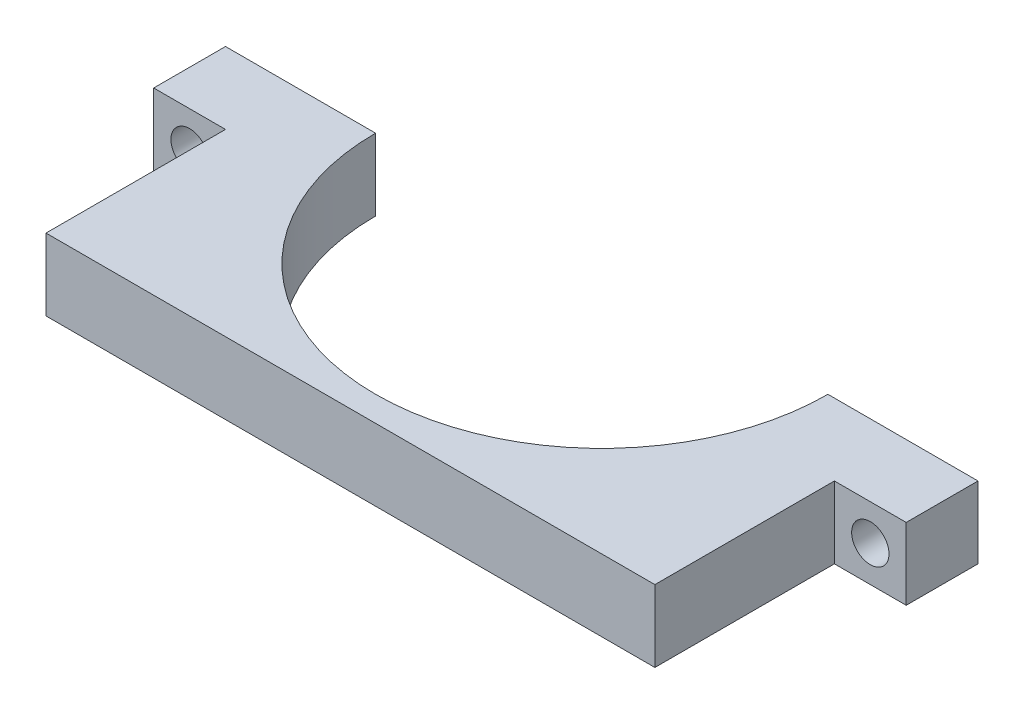
ISO-10303-21;
HEADER;
FILE_DESCRIPTION(('STEP AP214'),'2;1');
FILE_NAME('part.step','',(''),(''),'','','');
FILE_SCHEMA(('AUTOMOTIVE_DESIGN { 1 0 10303 214 1 1 1 1 }'));
ENDSEC;
DATA;
#1=APPLICATION_CONTEXT('core data for automotive mechanical design processes');
#2=APPLICATION_PROTOCOL_DEFINITION('international standard','automotive_design',2000,#1);
#3=PRODUCT_CONTEXT('',#1,'mechanical');
#4=PRODUCT('Part','Part','',(#3));
#5=PRODUCT_RELATED_PRODUCT_CATEGORY('part','',(#4));
#6=PRODUCT_DEFINITION_FORMATION('','',#4);
#7=PRODUCT_DEFINITION_CONTEXT('part definition',#1,'design');
#8=PRODUCT_DEFINITION('design','',#6,#7);
#9=PRODUCT_DEFINITION_SHAPE('','',#8);
#10=(LENGTH_UNIT() NAMED_UNIT(*) SI_UNIT(.MILLI.,.METRE.));
#11=(NAMED_UNIT(*) PLANE_ANGLE_UNIT() SI_UNIT($,.RADIAN.));
#12=(NAMED_UNIT(*) SI_UNIT($,.STERADIAN.) SOLID_ANGLE_UNIT());
#13=UNCERTAINTY_MEASURE_WITH_UNIT(LENGTH_MEASURE(1.E-05),#10,'distance_accuracy_value','');
#14=(GEOMETRIC_REPRESENTATION_CONTEXT(3) GLOBAL_UNCERTAINTY_ASSIGNED_CONTEXT((#13)) GLOBAL_UNIT_ASSIGNED_CONTEXT((#10,
#11,#12)) REPRESENTATION_CONTEXT('',''));
#15=CARTESIAN_POINT('',(0.,0.,0.));
#16=DIRECTION('',(0.,0.,1.));
#17=DIRECTION('',(1.,0.,0.));
#18=AXIS2_PLACEMENT_3D('',#15,#16,#17);
#19=CARTESIAN_POINT('',(5.08015601965994,12.7,0.));
#20=DIRECTION('',(0.,-1.,0.));
#21=DIRECTION('',(0.,0.,-1.));
#22=AXIS2_PLACEMENT_3D('',#19,#20,#21);
#23=CYLINDRICAL_SURFACE('',#22,40.005);
#24=CARTESIAN_POINT('',(5.08015601965994,0.,0.));
#25=DIRECTION('',(0.,-1.,0.));
#26=DIRECTION('',(0.,0.,1.));
#27=AXIS2_PLACEMENT_3D('',#24,#25,#26);
#28=CIRCLE('',#27,40.005);
#29=CARTESIAN_POINT('',(45.0851560196599,0.,0.));
#30=VERTEX_POINT('',#29);
#31=CARTESIAN_POINT('',(-34.9248439803401,0.,0.));
#32=VERTEX_POINT('',#31);
#33=EDGE_CURVE('E141',#30,#32,#28,.T.);
#34=ORIENTED_EDGE('',*,*,#33,.T.);
#35=DIRECTION('',(0.,-1.,0.));
#36=VECTOR('',#35,1.);
#37=CARTESIAN_POINT('',(-34.9248439803401,12.7,0.));
#38=LINE('',#37,#36);
#39=CARTESIAN_POINT('',(-34.9248439803401,12.7,0.));
#40=VERTEX_POINT('',#39);
#41=EDGE_CURVE('E11',#40,#32,#38,.T.);
#42=ORIENTED_EDGE('',*,*,#41,.F.);
#43=CARTESIAN_POINT('',(5.08015601965994,12.7,0.));
#44=DIRECTION('',(0.,-1.,0.));
#45=DIRECTION('',(0.,0.,1.));
#46=AXIS2_PLACEMENT_3D('',#43,#44,#45);
#47=CIRCLE('',#46,40.005);
#48=CARTESIAN_POINT('',(45.0851560196599,12.7,0.));
#49=VERTEX_POINT('',#48);
#50=EDGE_CURVE('E160',#49,#40,#47,.T.);
#51=ORIENTED_EDGE('',*,*,#50,.F.);
#52=DIRECTION('',(0.,-1.,0.));
#53=VECTOR('',#52,1.);
#54=CARTESIAN_POINT('',(45.0851560196599,12.7,0.));
#55=LINE('',#54,#53);
#56=EDGE_CURVE('E137',#49,#30,#55,.T.);
#57=ORIENTED_EDGE('',*,*,#56,.T.);
#58=EDGE_LOOP('',(#34,#42,#51,#57));
#59=FACE_BOUND('',#58,.T.);
#60=ADVANCED_FACE('F33',(#59),#23,.F.);
#61=CARTESIAN_POINT('',(-34.9248439803401,12.7,0.));
#62=DIRECTION('',(0.,0.,1.));
#63=DIRECTION('',(1.,0.,0.));
#64=AXIS2_PLACEMENT_3D('',#61,#62,#63);
#65=PLANE('',#64);
#66=CARTESIAN_POINT('',(-55.1178439803401,6.35,0.));
#67=DIRECTION('',(0.,0.,1.));
#68=DIRECTION('',(1.,0.,0.));
#69=AXIS2_PLACEMENT_3D('',#66,#67,#68);
#70=CIRCLE('',#69,3.302);
#71=CARTESIAN_POINT('',(-51.8158439803401,6.35,0.));
#72=VERTEX_POINT('',#71);
#73=EDGE_CURVE('E212',#72,#72,#70,.F.);
#74=ORIENTED_EDGE('',*,*,#73,.F.);
#75=EDGE_LOOP('',(#74));
#76=FACE_BOUND('',#75,.T.);
#77=DIRECTION('',(-1.,0.,0.));
#78=VECTOR('',#77,1.);
#79=CARTESIAN_POINT('',(-34.9248439803401,0.,0.));
#80=LINE('',#79,#78);
#81=CARTESIAN_POINT('',(-61.4678439803401,0.,0.));
#82=VERTEX_POINT('',#81);
#83=EDGE_CURVE('E144',#32,#82,#80,.T.);
#84=ORIENTED_EDGE('',*,*,#83,.T.);
#85=DIRECTION('',(0.,-1.,0.));
#86=VECTOR('',#85,1.);
#87=CARTESIAN_POINT('',(-61.4678439803401,12.7,0.));
#88=LINE('',#87,#86);
#89=CARTESIAN_POINT('',(-61.4678439803401,12.7,0.));
#90=VERTEX_POINT('',#89);
#91=EDGE_CURVE('E41',#90,#82,#88,.T.);
#92=ORIENTED_EDGE('',*,*,#91,.F.);
#93=DIRECTION('',(-1.,0.,0.));
#94=VECTOR('',#93,1.);
#95=CARTESIAN_POINT('',(-34.9248439803401,12.7,0.));
#96=LINE('',#95,#94);
#97=EDGE_CURVE('E98',#40,#90,#96,.T.);
#98=ORIENTED_EDGE('',*,*,#97,.F.);
#99=ORIENTED_EDGE('',*,*,#41,.T.);
#100=EDGE_LOOP('',(#84,#92,#98,#99));
#101=FACE_BOUND('',#100,.T.);
#102=ADVANCED_FACE('F230',(#76,#101),#65,.F.);
#103=CARTESIAN_POINT('',(-61.4678439803401,12.7,0.));
#104=DIRECTION('',(1.,0.,0.));
#105=DIRECTION('',(0.,0.,-1.));
#106=AXIS2_PLACEMENT_3D('',#103,#104,#105);
#107=PLANE('',#106);
#108=DIRECTION('',(0.,0.,1.));
#109=VECTOR('',#108,1.);
#110=CARTESIAN_POINT('',(-61.4678439803401,0.,0.));
#111=LINE('',#110,#109);
#112=CARTESIAN_POINT('',(-61.4678439803401,0.,12.7));
#113=VERTEX_POINT('',#112);
#114=EDGE_CURVE('E147',#82,#113,#111,.T.);
#115=ORIENTED_EDGE('',*,*,#114,.T.);
#116=DIRECTION('',(0.,-1.,0.));
#117=VECTOR('',#116,1.);
#118=CARTESIAN_POINT('',(-61.4678439803401,12.7,12.7));
#119=LINE('',#118,#117);
#120=CARTESIAN_POINT('',(-61.4678439803401,12.7,12.7));
#121=VERTEX_POINT('',#120);
#122=EDGE_CURVE('E173',#121,#113,#119,.T.);
#123=ORIENTED_EDGE('',*,*,#122,.F.);
#124=DIRECTION('',(0.,0.,1.));
#125=VECTOR('',#124,1.);
#126=CARTESIAN_POINT('',(-61.4678439803401,12.7,0.));
#127=LINE('',#126,#125);
#128=EDGE_CURVE('E181',#90,#121,#127,.T.);
#129=ORIENTED_EDGE('',*,*,#128,.F.);
#130=ORIENTED_EDGE('',*,*,#91,.T.);
#131=EDGE_LOOP('',(#115,#123,#129,#130));
#132=FACE_BOUND('',#131,.T.);
#133=ADVANCED_FACE('F179',(#132),#107,.F.);
#134=CARTESIAN_POINT('',(-61.4678439803401,12.7,12.7));
#135=DIRECTION('',(0.,0.,-1.));
#136=DIRECTION('',(-1.,0.,0.));
#137=AXIS2_PLACEMENT_3D('',#134,#135,#136);
#138=PLANE('',#137);
#139=CARTESIAN_POINT('',(-55.1178439803401,6.35,12.7));
#140=DIRECTION('',(0.,0.,1.));
#141=DIRECTION('',(1.,0.,0.));
#142=AXIS2_PLACEMENT_3D('',#139,#140,#141);
#143=CIRCLE('',#142,3.302);
#144=CARTESIAN_POINT('',(-51.8158439803401,6.35,12.7));
#145=VERTEX_POINT('',#144);
#146=EDGE_CURVE('E215',#145,#145,#143,.T.);
#147=ORIENTED_EDGE('',*,*,#146,.F.);
#148=EDGE_LOOP('',(#147));
#149=FACE_BOUND('',#148,.T.);
#150=DIRECTION('',(1.,0.,0.));
#151=VECTOR('',#150,1.);
#152=CARTESIAN_POINT('',(-61.4678439803401,0.,12.7));
#153=LINE('',#152,#151);
#154=CARTESIAN_POINT('',(-48.7678439803401,0.,12.7));
#155=VERTEX_POINT('',#154);
#156=EDGE_CURVE('E149',#113,#155,#153,.T.);
#157=ORIENTED_EDGE('',*,*,#156,.T.);
#158=DIRECTION('',(0.,-1.,0.));
#159=VECTOR('',#158,1.);
#160=CARTESIAN_POINT('',(-48.7678439803401,12.7,12.7));
#161=LINE('',#160,#159);
#162=CARTESIAN_POINT('',(-48.7678439803401,12.7,12.7));
#163=VERTEX_POINT('',#162);
#164=EDGE_CURVE('E170',#163,#155,#161,.T.);
#165=ORIENTED_EDGE('',*,*,#164,.F.);
#166=DIRECTION('',(1.,0.,0.));
#167=VECTOR('',#166,1.);
#168=CARTESIAN_POINT('',(-61.4678439803401,12.7,12.7));
#169=LINE('',#168,#167);
#170=EDGE_CURVE('E199',#121,#163,#169,.T.);
#171=ORIENTED_EDGE('',*,*,#170,.F.);
#172=ORIENTED_EDGE('',*,*,#122,.T.);
#173=EDGE_LOOP('',(#157,#165,#171,#172));
#174=FACE_BOUND('',#173,.T.);
#175=ADVANCED_FACE('F190',(#149,#174),#138,.F.);
#176=CARTESIAN_POINT('',(-48.7678439803401,12.7,12.7));
#177=DIRECTION('',(1.,0.,0.));
#178=DIRECTION('',(0.,0.,-1.));
#179=AXIS2_PLACEMENT_3D('',#176,#177,#178);
#180=PLANE('',#179);
#181=DIRECTION('',(0.,0.,1.));
#182=VECTOR('',#181,1.);
#183=CARTESIAN_POINT('',(-48.7678439803401,0.,12.7));
#184=LINE('',#183,#182);
#185=CARTESIAN_POINT('',(-48.7678439803401,0.,44.45));
#186=VERTEX_POINT('',#185);
#187=EDGE_CURVE('E151',#155,#186,#184,.T.);
#188=ORIENTED_EDGE('',*,*,#187,.T.);
#189=DIRECTION('',(0.,-1.,0.));
#190=VECTOR('',#189,1.);
#191=CARTESIAN_POINT('',(-48.7678439803401,12.7,44.45));
#192=LINE('',#191,#190);
#193=CARTESIAN_POINT('',(-48.7678439803401,12.7,44.45));
#194=VERTEX_POINT('',#193);
#195=EDGE_CURVE('E167',#194,#186,#192,.T.);
#196=ORIENTED_EDGE('',*,*,#195,.F.);
#197=DIRECTION('',(0.,0.,1.));
#198=VECTOR('',#197,1.);
#199=CARTESIAN_POINT('',(-48.7678439803401,12.7,12.7));
#200=LINE('',#199,#198);
#201=EDGE_CURVE('E196',#163,#194,#200,.T.);
#202=ORIENTED_EDGE('',*,*,#201,.F.);
#203=ORIENTED_EDGE('',*,*,#164,.T.);
#204=EDGE_LOOP('',(#188,#196,#202,#203));
#205=FACE_BOUND('',#204,.T.);
#206=ADVANCED_FACE('F194',(#205),#180,.F.);
#207=CARTESIAN_POINT('',(-48.7678439803401,12.7,44.45));
#208=DIRECTION('',(0.,0.,-1.));
#209=DIRECTION('',(-1.,0.,0.));
#210=AXIS2_PLACEMENT_3D('',#207,#208,#209);
#211=PLANE('',#210);
#212=DIRECTION('',(1.,0.,0.));
#213=VECTOR('',#212,1.);
#214=CARTESIAN_POINT('',(-48.7678439803401,0.,44.45));
#215=LINE('',#214,#213);
#216=CARTESIAN_POINT('',(58.9281560196599,0.,44.45));
#217=VERTEX_POINT('',#216);
#218=EDGE_CURVE('E153',#186,#217,#215,.T.);
#219=ORIENTED_EDGE('',*,*,#218,.T.);
#220=DIRECTION('',(0.,-1.,0.));
#221=VECTOR('',#220,1.);
#222=CARTESIAN_POINT('',(58.9281560196599,12.7,44.45));
#223=LINE('',#222,#221);
#224=CARTESIAN_POINT('',(58.9281560196599,12.7,44.45));
#225=VERTEX_POINT('',#224);
#226=EDGE_CURVE('E164',#225,#217,#223,.T.);
#227=ORIENTED_EDGE('',*,*,#226,.F.);
#228=DIRECTION('',(1.,0.,0.));
#229=VECTOR('',#228,1.);
#230=CARTESIAN_POINT('',(-48.7678439803401,12.7,44.45));
#231=LINE('',#230,#229);
#232=EDGE_CURVE('E198',#194,#225,#231,.T.);
#233=ORIENTED_EDGE('',*,*,#232,.F.);
#234=ORIENTED_EDGE('',*,*,#195,.T.);
#235=EDGE_LOOP('',(#219,#227,#233,#234));
#236=FACE_BOUND('',#235,.T.);
#237=ADVANCED_FACE('F228',(#236),#211,.F.);
#238=CARTESIAN_POINT('',(58.9281560196599,12.7,44.45));
#239=DIRECTION('',(-1.,0.,0.));
#240=DIRECTION('',(0.,0.,1.));
#241=AXIS2_PLACEMENT_3D('',#238,#239,#240);
#242=PLANE('',#241);
#243=DIRECTION('',(0.,0.,-1.));
#244=VECTOR('',#243,1.);
#245=CARTESIAN_POINT('',(58.9281560196599,0.,44.45));
#246=LINE('',#245,#244);
#247=CARTESIAN_POINT('',(58.9281560196599,0.,12.7));
#248=VERTEX_POINT('',#247);
#249=EDGE_CURVE('E155',#217,#248,#246,.T.);
#250=ORIENTED_EDGE('',*,*,#249,.T.);
#251=DIRECTION('',(0.,-1.,0.));
#252=VECTOR('',#251,1.);
#253=CARTESIAN_POINT('',(58.9281560196599,12.7,12.7));
#254=LINE('',#253,#252);
#255=CARTESIAN_POINT('',(58.9281560196599,12.7,12.7));
#256=VERTEX_POINT('',#255);
#257=EDGE_CURVE('E132',#256,#248,#254,.T.);
#258=ORIENTED_EDGE('',*,*,#257,.F.);
#259=DIRECTION('',(0.,0.,-1.));
#260=VECTOR('',#259,1.);
#261=CARTESIAN_POINT('',(58.9281560196599,12.7,44.45));
#262=LINE('',#261,#260);
#263=EDGE_CURVE('E123',#225,#256,#262,.T.);
#264=ORIENTED_EDGE('',*,*,#263,.F.);
#265=ORIENTED_EDGE('',*,*,#226,.T.);
#266=EDGE_LOOP('',(#250,#258,#264,#265));
#267=FACE_BOUND('',#266,.T.);
#268=ADVANCED_FACE('F242',(#267),#242,.F.);
#269=CARTESIAN_POINT('',(58.9281560196599,12.7,12.7));
#270=DIRECTION('',(0.,0.,-1.));
#271=DIRECTION('',(-1.,0.,0.));
#272=AXIS2_PLACEMENT_3D('',#269,#270,#271);
#273=PLANE('',#272);
#274=CARTESIAN_POINT('',(65.2781560196599,6.35,12.7));
#275=DIRECTION('',(0.,0.,1.));
#276=DIRECTION('',(1.,0.,0.));
#277=AXIS2_PLACEMENT_3D('',#274,#275,#276);
#278=CIRCLE('',#277,3.302);
#279=CARTESIAN_POINT('',(68.5801560196599,6.35,12.7));
#280=VERTEX_POINT('',#279);
#281=EDGE_CURVE('E209',#280,#280,#278,.T.);
#282=ORIENTED_EDGE('',*,*,#281,.F.);
#283=EDGE_LOOP('',(#282));
#284=FACE_BOUND('',#283,.T.);
#285=DIRECTION('',(1.,0.,0.));
#286=VECTOR('',#285,1.);
#287=CARTESIAN_POINT('',(58.9281560196599,0.,12.7));
#288=LINE('',#287,#286);
#289=CARTESIAN_POINT('',(71.6281560196599,0.,12.7));
#290=VERTEX_POINT('',#289);
#291=EDGE_CURVE('E131',#248,#290,#288,.T.);
#292=ORIENTED_EDGE('',*,*,#291,.T.);
#293=DIRECTION('',(0.,-1.,0.));
#294=VECTOR('',#293,1.);
#295=CARTESIAN_POINT('',(71.6281560196599,12.7,12.7));
#296=LINE('',#295,#294);
#297=CARTESIAN_POINT('',(71.6281560196599,12.7,12.7));
#298=VERTEX_POINT('',#297);
#299=EDGE_CURVE('E128',#298,#290,#296,.T.);
#300=ORIENTED_EDGE('',*,*,#299,.F.);
#301=DIRECTION('',(1.,0.,0.));
#302=VECTOR('',#301,1.);
#303=CARTESIAN_POINT('',(58.9281560196599,12.7,12.7));
#304=LINE('',#303,#302);
#305=EDGE_CURVE('E117',#256,#298,#304,.T.);
#306=ORIENTED_EDGE('',*,*,#305,.F.);
#307=ORIENTED_EDGE('',*,*,#257,.T.);
#308=EDGE_LOOP('',(#292,#300,#306,#307));
#309=FACE_BOUND('',#308,.T.);
#310=ADVANCED_FACE('F129',(#284,#309),#273,.F.);
#311=CARTESIAN_POINT('',(71.6281560196599,12.7,12.7));
#312=DIRECTION('',(-1.,0.,0.));
#313=DIRECTION('',(0.,0.,1.));
#314=AXIS2_PLACEMENT_3D('',#311,#312,#313);
#315=PLANE('',#314);
#316=DIRECTION('',(0.,0.,-1.));
#317=VECTOR('',#316,1.);
#318=CARTESIAN_POINT('',(71.6281560196599,0.,12.7));
#319=LINE('',#318,#317);
#320=CARTESIAN_POINT('',(71.6281560196599,0.,0.));
#321=VERTEX_POINT('',#320);
#322=EDGE_CURVE('E84',#290,#321,#319,.T.);
#323=ORIENTED_EDGE('',*,*,#322,.T.);
#324=DIRECTION('',(0.,-1.,0.));
#325=VECTOR('',#324,1.);
#326=CARTESIAN_POINT('',(71.6281560196599,12.7,0.));
#327=LINE('',#326,#325);
#328=CARTESIAN_POINT('',(71.6281560196599,12.7,0.));
#329=VERTEX_POINT('',#328);
#330=EDGE_CURVE('E133',#329,#321,#327,.T.);
#331=ORIENTED_EDGE('',*,*,#330,.F.);
#332=DIRECTION('',(0.,0.,-1.));
#333=VECTOR('',#332,1.);
#334=CARTESIAN_POINT('',(71.6281560196599,12.7,12.7));
#335=LINE('',#334,#333);
#336=EDGE_CURVE('E121',#298,#329,#335,.T.);
#337=ORIENTED_EDGE('',*,*,#336,.F.);
#338=ORIENTED_EDGE('',*,*,#299,.T.);
#339=EDGE_LOOP('',(#323,#331,#337,#338));
#340=FACE_BOUND('',#339,.T.);
#341=ADVANCED_FACE('F135',(#340),#315,.F.);
#342=CARTESIAN_POINT('',(71.6281560196599,12.7,0.));
#343=DIRECTION('',(0.,0.,1.));
#344=DIRECTION('',(1.,0.,0.));
#345=AXIS2_PLACEMENT_3D('',#342,#343,#344);
#346=PLANE('',#345);
#347=CARTESIAN_POINT('',(65.2781560196599,6.35,0.));
#348=DIRECTION('',(0.,0.,1.));
#349=DIRECTION('',(1.,0.,0.));
#350=AXIS2_PLACEMENT_3D('',#347,#348,#349);
#351=CIRCLE('',#350,3.302);
#352=CARTESIAN_POINT('',(68.5801560196599,6.35,0.));
#353=VERTEX_POINT('',#352);
#354=EDGE_CURVE('E145',#353,#353,#351,.F.);
#355=ORIENTED_EDGE('',*,*,#354,.F.);
#356=EDGE_LOOP('',(#355));
#357=FACE_BOUND('',#356,.T.);
#358=DIRECTION('',(-1.,0.,0.));
#359=VECTOR('',#358,1.);
#360=CARTESIAN_POINT('',(71.6281560196599,0.,0.));
#361=LINE('',#360,#359);
#362=EDGE_CURVE('E90',#321,#30,#361,.T.);
#363=ORIENTED_EDGE('',*,*,#362,.T.);
#364=ORIENTED_EDGE('',*,*,#56,.F.);
#365=DIRECTION('',(-1.,0.,0.));
#366=VECTOR('',#365,1.);
#367=CARTESIAN_POINT('',(71.6281560196599,12.7,0.));
#368=LINE('',#367,#366);
#369=EDGE_CURVE('E49',#329,#49,#368,.T.);
#370=ORIENTED_EDGE('',*,*,#369,.F.);
#371=ORIENTED_EDGE('',*,*,#330,.T.);
#372=EDGE_LOOP('',(#363,#364,#370,#371));
#373=FACE_BOUND('',#372,.T.);
#374=ADVANCED_FACE('F257',(#357,#373),#346,.F.);
#375=CARTESIAN_POINT('',(5.08015601965994,12.7,0.));
#376=DIRECTION('',(0.,1.,0.));
#377=DIRECTION('',(0.,0.,1.));
#378=AXIS2_PLACEMENT_3D('',#375,#376,#377);
#379=PLANE('',#378);
#380=ORIENTED_EDGE('',*,*,#50,.T.);
#381=ORIENTED_EDGE('',*,*,#97,.T.);
#382=ORIENTED_EDGE('',*,*,#128,.T.);
#383=ORIENTED_EDGE('',*,*,#170,.T.);
#384=ORIENTED_EDGE('',*,*,#201,.T.);
#385=ORIENTED_EDGE('',*,*,#232,.T.);
#386=ORIENTED_EDGE('',*,*,#263,.T.);
#387=ORIENTED_EDGE('',*,*,#305,.T.);
#388=ORIENTED_EDGE('',*,*,#336,.T.);
#389=ORIENTED_EDGE('',*,*,#369,.T.);
#390=EDGE_LOOP('',(#380,#381,#382,#383,#384,#385,#386,#387,#388,#389));
#391=FACE_BOUND('',#390,.T.);
#392=ADVANCED_FACE('F119',(#391),#379,.T.);
#393=CARTESIAN_POINT('',(5.08015601965994,0.,0.));
#394=DIRECTION('',(0.,1.,0.));
#395=DIRECTION('',(0.,0.,1.));
#396=AXIS2_PLACEMENT_3D('',#393,#394,#395);
#397=PLANE('',#396);
#398=ORIENTED_EDGE('',*,*,#33,.F.);
#399=ORIENTED_EDGE('',*,*,#362,.F.);
#400=ORIENTED_EDGE('',*,*,#322,.F.);
#401=ORIENTED_EDGE('',*,*,#291,.F.);
#402=ORIENTED_EDGE('',*,*,#249,.F.);
#403=ORIENTED_EDGE('',*,*,#218,.F.);
#404=ORIENTED_EDGE('',*,*,#187,.F.);
#405=ORIENTED_EDGE('',*,*,#156,.F.);
#406=ORIENTED_EDGE('',*,*,#114,.F.);
#407=ORIENTED_EDGE('',*,*,#83,.F.);
#408=EDGE_LOOP('',(#398,#399,#400,#401,#402,#403,#404,#405,#406,#407));
#409=FACE_BOUND('',#408,.T.);
#410=ADVANCED_FACE('F185',(#409),#397,.F.);
#411=CARTESIAN_POINT('',(65.2781560196599,6.35,-0.00100000000003049));
#412=DIRECTION('',(0.,0.,1.));
#413=DIRECTION('',(1.,0.,0.));
#414=AXIS2_PLACEMENT_3D('',#411,#412,#413);
#415=CYLINDRICAL_SURFACE('',#414,3.302);
#416=CARTESIAN_POINT('',(68.5801560196599,6.35,12.7));
#417=CARTESIAN_POINT('',(68.5801560196599,6.35,12.5677083333333));
#418=CARTESIAN_POINT('',(68.5801560196599,6.35,12.4354166666667));
#419=CARTESIAN_POINT('',(68.5801560196599,6.35,12.1708333333333));
#420=CARTESIAN_POINT('',(68.5801560196599,6.35,12.0385416666667));
#421=CARTESIAN_POINT('',(68.5801560196599,6.35,11.7739583333333));
#422=CARTESIAN_POINT('',(68.5801560196599,6.35,11.6416666666667));
#423=CARTESIAN_POINT('',(68.5801560196599,6.35,11.3770833333333));
#424=CARTESIAN_POINT('',(68.5801560196599,6.35,11.2447916666667));
#425=CARTESIAN_POINT('',(68.5801560196599,6.35,10.9802083333333));
#426=CARTESIAN_POINT('',(68.5801560196599,6.35,10.8479166666667));
#427=CARTESIAN_POINT('',(68.5801560196599,6.35,10.5833333333333));
#428=CARTESIAN_POINT('',(68.5801560196599,6.35,10.4510416666666));
#429=CARTESIAN_POINT('',(68.5801560196599,6.35,10.1864583333333));
#430=CARTESIAN_POINT('',(68.5801560196599,6.35,10.0541666666666));
#431=CARTESIAN_POINT('',(68.5801560196599,6.35,9.78958333333332));
#432=CARTESIAN_POINT('',(68.5801560196599,6.35,9.65729166666665));
#433=CARTESIAN_POINT('',(68.5801560196599,6.35,9.39270833333331));
#434=CARTESIAN_POINT('',(68.5801560196599,6.35,9.26041666666665));
#435=CARTESIAN_POINT('',(68.5801560196599,6.35,8.99583333333331));
#436=CARTESIAN_POINT('',(68.5801560196599,6.35,8.86354166666665));
#437=CARTESIAN_POINT('',(68.5801560196599,6.35,8.59895833333331));
#438=CARTESIAN_POINT('',(68.5801560196599,6.35,8.46666666666665));
#439=CARTESIAN_POINT('',(68.5801560196599,6.35,8.20208333333331));
#440=CARTESIAN_POINT('',(68.5801560196599,6.35,8.06979166666665));
#441=CARTESIAN_POINT('',(68.5801560196599,6.35,7.80520833333331));
#442=CARTESIAN_POINT('',(68.5801560196599,6.35,7.67291666666665));
#443=CARTESIAN_POINT('',(68.5801560196599,6.35,7.40833333333331));
#444=CARTESIAN_POINT('',(68.5801560196599,6.35,7.27604166666664));
#445=CARTESIAN_POINT('',(68.5801560196599,6.35,7.01145833333331));
#446=CARTESIAN_POINT('',(68.5801560196599,6.35,6.87916666666664));
#447=CARTESIAN_POINT('',(68.5801560196599,6.35,6.61458333333331));
#448=CARTESIAN_POINT('',(68.5801560196599,6.35,6.48229166666664));
#449=CARTESIAN_POINT('',(68.5801560196599,6.35,6.21770833333331));
#450=CARTESIAN_POINT('',(68.5801560196599,6.35,6.08541666666664));
#451=CARTESIAN_POINT('',(68.5801560196599,6.35,5.82083333333331));
#452=CARTESIAN_POINT('',(68.5801560196599,6.35,5.68854166666664));
#453=CARTESIAN_POINT('',(68.5801560196599,6.35,5.42395833333331));
#454=CARTESIAN_POINT('',(68.5801560196599,6.35,5.29166666666664));
#455=CARTESIAN_POINT('',(68.5801560196599,6.35,5.02708333333331));
#456=CARTESIAN_POINT('',(68.5801560196599,6.35,4.89479166666664));
#457=CARTESIAN_POINT('',(68.5801560196599,6.35,4.63020833333331));
#458=CARTESIAN_POINT('',(68.5801560196599,6.35,4.49791666666664));
#459=CARTESIAN_POINT('',(68.5801560196599,6.35,4.23333333333331));
#460=CARTESIAN_POINT('',(68.5801560196599,6.35,4.10104166666664));
#461=CARTESIAN_POINT('',(68.5801560196599,6.35,3.83645833333331));
#462=CARTESIAN_POINT('',(68.5801560196599,6.35,3.70416666666664));
#463=CARTESIAN_POINT('',(68.5801560196599,6.35,3.43958333333331));
#464=CARTESIAN_POINT('',(68.5801560196599,6.35,3.30729166666664));
#465=CARTESIAN_POINT('',(68.5801560196599,6.35,3.04270833333331));
#466=CARTESIAN_POINT('',(68.5801560196599,6.35,2.91041666666664));
#467=CARTESIAN_POINT('',(68.5801560196599,6.35,2.64583333333331));
#468=CARTESIAN_POINT('',(68.5801560196599,6.35,2.51354166666664));
#469=CARTESIAN_POINT('',(68.5801560196599,6.35,2.2489583333333));
#470=CARTESIAN_POINT('',(68.5801560196599,6.35,2.11666666666664));
#471=CARTESIAN_POINT('',(68.5801560196599,6.35,1.8520833333333));
#472=CARTESIAN_POINT('',(68.5801560196599,6.35,1.71979166666664));
#473=CARTESIAN_POINT('',(68.5801560196599,6.35,1.4552083333333));
#474=CARTESIAN_POINT('',(68.5801560196599,6.35,1.32291666666664));
#475=CARTESIAN_POINT('',(68.5801560196599,6.35,1.0583333333333));
#476=CARTESIAN_POINT('',(68.5801560196599,6.35,0.926041666666637));
#477=CARTESIAN_POINT('',(68.5801560196599,6.35,0.661458333333303));
#478=CARTESIAN_POINT('',(68.5801560196599,6.35,0.529166666666637));
#479=CARTESIAN_POINT('',(68.5801560196599,6.35,0.264583333333303));
#480=CARTESIAN_POINT('',(68.5801560196599,6.35,0.132291666666636));
#481=CARTESIAN_POINT('',(68.5801560196599,6.35,0.));
#482=B_SPLINE_CURVE_WITH_KNOTS('',3,(#416,#417,#418,#419,#420,#421,#422,#423,#424,#425,#426,
#427,#428,#429,#430,#431,#432,#433,#434,#435,#436,#437,#438,#439,#440,#441,#442,#443,#444,#445,
#446,#447,#448,#449,#450,#451,#452,#453,#454,#455,#456,#457,#458,#459,#460,#461,#462,#463,#464,
#465,#466,#467,#468,#469,#470,#471,#472,#473,#474,#475,#476,#477,#478,#479,#480,#481),
.UNSPECIFIED.,.F.,.F.,(4,2,2,2,2,2,2,2,2,2,2,2,2,2,2,2,2,2,2,2,2,2,2,2,2,2,2,2,2,2,2,2,4),(0.,
0.396875000000001,0.793750000000001,1.190625,1.5875,1.984375,2.38125,2.778125,3.175,
3.57187500000001,3.96875000000001,4.36562500000001,4.76250000000001,5.15937500000001,
5.55625000000001,5.95312500000001,6.35000000000001,6.74687500000001,7.14375000000001,
7.54062500000001,7.93750000000001,8.33437500000001,8.73125000000001,9.12812500000001,
9.52500000000001,9.92187500000001,10.31875,10.715625,11.1125,11.509375,11.90625,12.303125,12.7),.UNSPECIFIED.);
#483=EDGE_CURVE('BSEAM263',#280,#353,#482,.T.);
#484=ORIENTED_EDGE('',*,*,#281,.T.);
#485=ORIENTED_EDGE('',*,*,#354,.T.);
#486=ORIENTED_EDGE('',*,*,#483,.T.);
#487=ORIENTED_EDGE('',*,*,#483,.F.);
#488=EDGE_LOOP('',(#484,#486,#485,#487));
#489=FACE_BOUND('',#488,.T.);
#490=ADVANCED_FACE('F263',(#489),#415,.F.);
#491=CARTESIAN_POINT('',(-55.1178439803401,6.35,-0.00100000000003049));
#492=DIRECTION('',(0.,0.,1.));
#493=DIRECTION('',(1.,0.,0.));
#494=AXIS2_PLACEMENT_3D('',#491,#492,#493);
#495=CYLINDRICAL_SURFACE('',#494,3.302);
#496=CARTESIAN_POINT('',(-51.8158439803401,6.35,12.7));
#497=CARTESIAN_POINT('',(-51.8158439803401,6.35,12.5677083333333));
#498=CARTESIAN_POINT('',(-51.8158439803401,6.35,12.4354166666667));
#499=CARTESIAN_POINT('',(-51.8158439803401,6.35,12.1708333333333));
#500=CARTESIAN_POINT('',(-51.8158439803401,6.35,12.0385416666667));
#501=CARTESIAN_POINT('',(-51.8158439803401,6.35,11.7739583333333));
#502=CARTESIAN_POINT('',(-51.8158439803401,6.35,11.6416666666667));
#503=CARTESIAN_POINT('',(-51.8158439803401,6.35,11.3770833333333));
#504=CARTESIAN_POINT('',(-51.8158439803401,6.35,11.2447916666667));
#505=CARTESIAN_POINT('',(-51.8158439803401,6.35,10.9802083333333));
#506=CARTESIAN_POINT('',(-51.8158439803401,6.35,10.8479166666667));
#507=CARTESIAN_POINT('',(-51.8158439803401,6.35,10.5833333333333));
#508=CARTESIAN_POINT('',(-51.8158439803401,6.35,10.4510416666667));
#509=CARTESIAN_POINT('',(-51.8158439803401,6.35,10.1864583333333));
#510=CARTESIAN_POINT('',(-51.8158439803401,6.35,10.0541666666667));
#511=CARTESIAN_POINT('',(-51.8158439803401,6.35,9.78958333333332));
#512=CARTESIAN_POINT('',(-51.8158439803401,6.35,9.65729166666666));
#513=CARTESIAN_POINT('',(-51.8158439803401,6.35,9.39270833333332));
#514=CARTESIAN_POINT('',(-51.8158439803401,6.35,9.26041666666666));
#515=CARTESIAN_POINT('',(-51.8158439803401,6.35,8.99583333333332));
#516=CARTESIAN_POINT('',(-51.8158439803401,6.35,8.86354166666666));
#517=CARTESIAN_POINT('',(-51.8158439803401,6.35,8.59895833333333));
#518=CARTESIAN_POINT('',(-51.8158439803401,6.35,8.46666666666666));
#519=CARTESIAN_POINT('',(-51.8158439803401,6.35,8.20208333333333));
#520=CARTESIAN_POINT('',(-51.8158439803401,6.35,8.06979166666666));
#521=CARTESIAN_POINT('',(-51.8158439803401,6.35,7.80520833333333));
#522=CARTESIAN_POINT('',(-51.8158439803401,6.35,7.67291666666666));
#523=CARTESIAN_POINT('',(-51.8158439803401,6.35,7.40833333333333));
#524=CARTESIAN_POINT('',(-51.8158439803401,6.35,7.27604166666666));
#525=CARTESIAN_POINT('',(-51.8158439803401,6.35,7.01145833333333));
#526=CARTESIAN_POINT('',(-51.8158439803401,6.35,6.87916666666666));
#527=CARTESIAN_POINT('',(-51.8158439803401,6.35,6.61458333333333));
#528=CARTESIAN_POINT('',(-51.8158439803401,6.35,6.48229166666666));
#529=CARTESIAN_POINT('',(-51.8158439803401,6.35,6.21770833333333));
#530=CARTESIAN_POINT('',(-51.8158439803401,6.35,6.08541666666666));
#531=CARTESIAN_POINT('',(-51.8158439803401,6.35,5.82083333333333));
#532=CARTESIAN_POINT('',(-51.8158439803401,6.35,5.68854166666666));
#533=CARTESIAN_POINT('',(-51.8158439803401,6.35,5.42395833333333));
#534=CARTESIAN_POINT('',(-51.8158439803401,6.35,5.29166666666666));
#535=CARTESIAN_POINT('',(-51.8158439803401,6.35,5.02708333333333));
#536=CARTESIAN_POINT('',(-51.8158439803401,6.35,4.89479166666666));
#537=CARTESIAN_POINT('',(-51.8158439803401,6.35,4.63020833333333));
#538=CARTESIAN_POINT('',(-51.8158439803401,6.35,4.49791666666667));
#539=CARTESIAN_POINT('',(-51.8158439803401,6.35,4.23333333333333));
#540=CARTESIAN_POINT('',(-51.8158439803401,6.35,4.10104166666667));
#541=CARTESIAN_POINT('',(-51.8158439803401,6.35,3.83645833333333));
#542=CARTESIAN_POINT('',(-51.8158439803401,6.35,3.70416666666667));
#543=CARTESIAN_POINT('',(-51.8158439803401,6.35,3.43958333333333));
#544=CARTESIAN_POINT('',(-51.8158439803401,6.35,3.30729166666667));
#545=CARTESIAN_POINT('',(-51.8158439803401,6.35,3.04270833333333));
#546=CARTESIAN_POINT('',(-51.8158439803401,6.35,2.91041666666667));
#547=CARTESIAN_POINT('',(-51.8158439803401,6.35,2.64583333333333));
#548=CARTESIAN_POINT('',(-51.8158439803401,6.35,2.51354166666667));
#549=CARTESIAN_POINT('',(-51.8158439803401,6.35,2.24895833333333));
#550=CARTESIAN_POINT('',(-51.8158439803401,6.35,2.11666666666667));
#551=CARTESIAN_POINT('',(-51.8158439803401,6.35,1.85208333333334));
#552=CARTESIAN_POINT('',(-51.8158439803401,6.35,1.71979166666667));
#553=CARTESIAN_POINT('',(-51.8158439803401,6.35,1.45520833333334));
#554=CARTESIAN_POINT('',(-51.8158439803401,6.35,1.32291666666667));
#555=CARTESIAN_POINT('',(-51.8158439803401,6.35,1.05833333333334));
#556=CARTESIAN_POINT('',(-51.8158439803401,6.35,0.926041666666671));
#557=CARTESIAN_POINT('',(-51.8158439803401,6.35,0.661458333333338));
#558=CARTESIAN_POINT('',(-51.8158439803401,6.35,0.529166666666671));
#559=CARTESIAN_POINT('',(-51.8158439803401,6.35,0.264583333333338));
#560=CARTESIAN_POINT('',(-51.8158439803401,6.35,0.132291666666672));
#561=CARTESIAN_POINT('',(-51.8158439803401,6.35,0.));
#562=B_SPLINE_CURVE_WITH_KNOTS('',3,(#496,#497,#498,#499,#500,#501,#502,#503,#504,#505,#506,
#507,#508,#509,#510,#511,#512,#513,#514,#515,#516,#517,#518,#519,#520,#521,#522,#523,#524,#525,
#526,#527,#528,#529,#530,#531,#532,#533,#534,#535,#536,#537,#538,#539,#540,#541,#542,#543,#544,
#545,#546,#547,#548,#549,#550,#551,#552,#553,#554,#555,#556,#557,#558,#559,#560,#561),
.UNSPECIFIED.,.F.,.F.,(4,2,2,2,2,2,2,2,2,2,2,2,2,2,2,2,2,2,2,2,2,2,2,2,2,2,2,2,2,2,2,2,4),(0.,
0.396875,0.793749999999999,1.190625,1.5875,1.984375,2.38125,2.778125,3.175,3.571875,
3.96874999999999,4.36562499999999,4.76249999999999,5.15937499999999,5.55624999999999,
5.95312499999999,6.34999999999999,6.74687499999999,7.14374999999999,7.54062499999999,
7.93749999999999,8.33437499999999,8.73124999999999,9.12812499999999,9.52499999999999,
9.92187499999999,10.31875,10.715625,11.1125,11.509375,11.90625,12.303125,12.7),.UNSPECIFIED.);
#563=EDGE_CURVE('BSEAM219',#145,#72,#562,.T.);
#564=ORIENTED_EDGE('',*,*,#146,.T.);
#565=ORIENTED_EDGE('',*,*,#73,.T.);
#566=ORIENTED_EDGE('',*,*,#563,.T.);
#567=ORIENTED_EDGE('',*,*,#563,.F.);
#568=EDGE_LOOP('',(#564,#566,#565,#567));
#569=FACE_BOUND('',#568,.T.);
#570=ADVANCED_FACE('F219',(#569),#495,.F.);
#571=CLOSED_SHELL('',(#60,#102,#133,#175,#206,#237,#268,#310,#341,#374,#392,#410,#490,#570));
#572=MANIFOLD_SOLID_BREP('B2',#571);
#573=ADVANCED_BREP_SHAPE_REPRESENTATION('',(#18,#572),#14);
#574=SHAPE_DEFINITION_REPRESENTATION(#9,#573);
ENDSEC;
END-ISO-10303-21;
